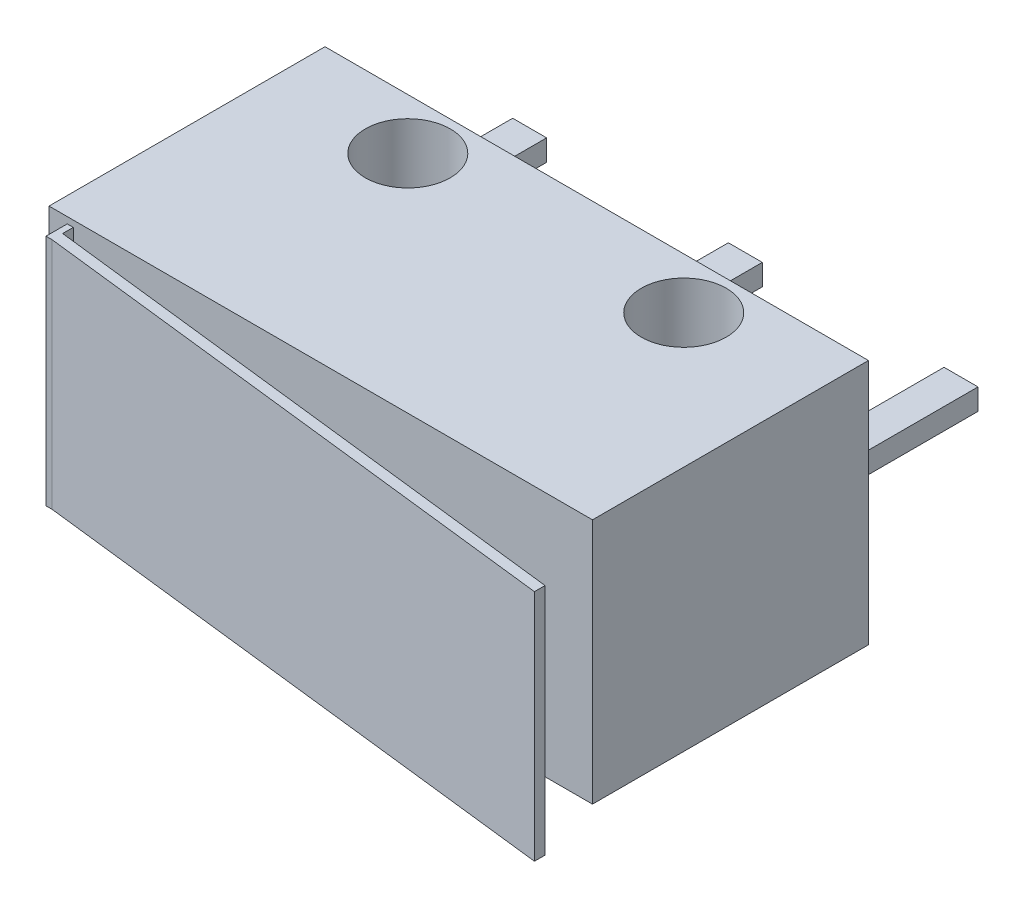
ISO-10303-21;
HEADER;
FILE_DESCRIPTION(('STEP AP214'),'2;1');
FILE_NAME('part.step','',(''),(''),'','','');
FILE_SCHEMA(('AUTOMOTIVE_DESIGN { 1 0 10303 214 1 1 1 1 }'));
ENDSEC;
DATA;
#1=APPLICATION_CONTEXT('core data for automotive mechanical design processes');
#2=APPLICATION_PROTOCOL_DEFINITION('international standard','automotive_design',2000,#1);
#3=PRODUCT_CONTEXT('',#1,'mechanical');
#4=PRODUCT('Part','Part','',(#3));
#5=PRODUCT_RELATED_PRODUCT_CATEGORY('part','',(#4));
#6=PRODUCT_DEFINITION_FORMATION('','',#4);
#7=PRODUCT_DEFINITION_CONTEXT('part definition',#1,'design');
#8=PRODUCT_DEFINITION('design','',#6,#7);
#9=PRODUCT_DEFINITION_SHAPE('','',#8);
#10=(LENGTH_UNIT() NAMED_UNIT(*) SI_UNIT(.MILLI.,.METRE.));
#11=(NAMED_UNIT(*) PLANE_ANGLE_UNIT() SI_UNIT($,.RADIAN.));
#12=(NAMED_UNIT(*) SI_UNIT($,.STERADIAN.) SOLID_ANGLE_UNIT());
#13=UNCERTAINTY_MEASURE_WITH_UNIT(LENGTH_MEASURE(1.E-05),#10,'distance_accuracy_value','');
#14=(GEOMETRIC_REPRESENTATION_CONTEXT(3) GLOBAL_UNCERTAINTY_ASSIGNED_CONTEXT((#13)) GLOBAL_UNIT_ASSIGNED_CONTEXT((#10,
#11,#12)) REPRESENTATION_CONTEXT('',''));
#15=CARTESIAN_POINT('',(0.,0.,0.));
#16=DIRECTION('',(0.,0.,1.));
#17=DIRECTION('',(1.,0.,0.));
#18=AXIS2_PLACEMENT_3D('',#15,#16,#17);
#19=CARTESIAN_POINT('',(-6.4,5.8,3.25));
#20=DIRECTION('',(0.,0.,-1.));
#21=DIRECTION('',(-1.,0.,0.));
#22=AXIS2_PLACEMENT_3D('',#19,#20,#21);
#23=PLANE('',#22);
#24=DIRECTION('',(1.,0.,0.));
#25=VECTOR('',#24,1.);
#26=CARTESIAN_POINT('',(-6.4,0.,3.25));
#27=LINE('',#26,#25);
#28=CARTESIAN_POINT('',(-6.4,0.,3.25));
#29=VERTEX_POINT('',#28);
#30=CARTESIAN_POINT('',(6.4,0.,3.25));
#31=VERTEX_POINT('',#30);
#32=EDGE_CURVE('E390',#29,#31,#27,.T.);
#33=ORIENTED_EDGE('',*,*,#32,.T.);
#34=DIRECTION('',(0.,-1.,0.));
#35=VECTOR('',#34,1.);
#36=CARTESIAN_POINT('',(6.4,5.8,3.25));
#37=LINE('',#36,#35);
#38=CARTESIAN_POINT('',(6.4,5.8,3.25));
#39=VERTEX_POINT('',#38);
#40=EDGE_CURVE('E399',#39,#31,#37,.T.);
#41=ORIENTED_EDGE('',*,*,#40,.F.);
#42=DIRECTION('',(1.,0.,0.));
#43=VECTOR('',#42,1.);
#44=CARTESIAN_POINT('',(-6.4,5.8,3.25));
#45=LINE('',#44,#43);
#46=CARTESIAN_POINT('',(-6.4,5.8,3.25));
#47=VERTEX_POINT('',#46);
#48=EDGE_CURVE('E396',#47,#39,#45,.T.);
#49=ORIENTED_EDGE('',*,*,#48,.F.);
#50=DIRECTION('',(0.,-1.,0.));
#51=VECTOR('',#50,1.);
#52=CARTESIAN_POINT('',(-6.4,5.8,3.25));
#53=LINE('',#52,#51);
#54=EDGE_CURVE('E414',#47,#29,#53,.T.);
#55=ORIENTED_EDGE('',*,*,#54,.T.);
#56=EDGE_LOOP('',(#33,#41,#49,#55));
#57=FACE_BOUND('',#56,.T.);
#58=DIRECTION('',(0.,1.,0.));
#59=VECTOR('',#58,1.);
#60=CARTESIAN_POINT('',(-5.82899401413521,0.150000000000002,3.25));
#61=LINE('',#60,#59);
#62=CARTESIAN_POINT('',(-5.82899401413521,0.150000000000002,3.25));
#63=VERTEX_POINT('',#62);
#64=CARTESIAN_POINT('',(-5.82899401413521,5.65,3.25));
#65=VERTEX_POINT('',#64);
#66=EDGE_CURVE('E223',#63,#65,#61,.T.);
#67=ORIENTED_EDGE('',*,*,#66,.F.);
#68=DIRECTION('',(1.,0.,0.));
#69=VECTOR('',#68,1.);
#70=CARTESIAN_POINT('',(-5.97100598586479,0.150000000000002,3.25));
#71=LINE('',#70,#69);
#72=CARTESIAN_POINT('',(-5.97100598586479,0.150000000000002,3.25));
#73=VERTEX_POINT('',#72);
#74=EDGE_CURVE('E713',#73,#63,#71,.T.);
#75=ORIENTED_EDGE('',*,*,#74,.F.);
#76=DIRECTION('',(0.,-1.,0.));
#77=VECTOR('',#76,1.);
#78=CARTESIAN_POINT('',(-5.97100598586479,0.150000000000002,3.25));
#79=LINE('',#78,#77);
#80=CARTESIAN_POINT('',(-5.97100598586479,5.65,3.25));
#81=VERTEX_POINT('',#80);
#82=EDGE_CURVE('E68',#81,#73,#79,.T.);
#83=ORIENTED_EDGE('',*,*,#82,.F.);
#84=DIRECTION('',(-1.,0.,0.));
#85=VECTOR('',#84,1.);
#86=CARTESIAN_POINT('',(-5.97100598586479,5.65,3.25));
#87=LINE('',#86,#85);
#88=EDGE_CURVE('E726',#65,#81,#87,.T.);
#89=ORIENTED_EDGE('',*,*,#88,.F.);
#90=EDGE_LOOP('',(#67,#75,#83,#89));
#91=FACE_BOUND('',#90,.T.);
#92=ADVANCED_FACE('F45',(#57,#91),#23,.F.);
#93=CARTESIAN_POINT('',(-6.4,5.8,-3.25));
#94=DIRECTION('',(0.,0.,1.));
#95=DIRECTION('',(1.,0.,0.));
#96=AXIS2_PLACEMENT_3D('',#93,#94,#95);
#97=PLANE('',#96);
#98=DIRECTION('',(1.,0.,0.));
#99=VECTOR('',#98,1.);
#100=CARTESIAN_POINT('',(0.4,3.05127711530208,-3.25));
#101=LINE('',#100,#99);
#102=CARTESIAN_POINT('',(-0.4,3.05127711530208,-3.25));
#103=VERTEX_POINT('',#102);
#104=CARTESIAN_POINT('',(0.4,3.05127711530208,-3.25));
#105=VERTEX_POINT('',#104);
#106=EDGE_CURVE('E258',#103,#105,#101,.T.);
#107=ORIENTED_EDGE('',*,*,#106,.F.);
#108=DIRECTION('',(0.,1.,0.));
#109=VECTOR('',#108,1.);
#110=CARTESIAN_POINT('',(-0.4,2.55127711530208,-3.25));
#111=LINE('',#110,#109);
#112=CARTESIAN_POINT('',(-0.4,2.55127711530208,-3.25));
#113=VERTEX_POINT('',#112);
#114=EDGE_CURVE('E303',#113,#103,#111,.T.);
#115=ORIENTED_EDGE('',*,*,#114,.F.);
#116=DIRECTION('',(-1.,0.,0.));
#117=VECTOR('',#116,1.);
#118=CARTESIAN_POINT('',(0.4,2.55127711530208,-3.25));
#119=LINE('',#118,#117);
#120=CARTESIAN_POINT('',(0.4,2.55127711530208,-3.25));
#121=VERTEX_POINT('',#120);
#122=EDGE_CURVE('E307',#121,#113,#119,.T.);
#123=ORIENTED_EDGE('',*,*,#122,.F.);
#124=DIRECTION('',(0.,-1.,0.));
#125=VECTOR('',#124,1.);
#126=CARTESIAN_POINT('',(0.4,2.55127711530208,-3.25));
#127=LINE('',#126,#125);
#128=EDGE_CURVE('E312',#105,#121,#127,.T.);
#129=ORIENTED_EDGE('',*,*,#128,.F.);
#130=EDGE_LOOP('',(#107,#115,#123,#129));
#131=FACE_BOUND('',#130,.T.);
#132=DIRECTION('',(-1.,0.,0.));
#133=VECTOR('',#132,1.);
#134=CARTESIAN_POINT('',(-6.4,0.,-3.25));
#135=LINE('',#134,#133);
#136=CARTESIAN_POINT('',(6.4,0.,-3.25));
#137=VERTEX_POINT('',#136);
#138=CARTESIAN_POINT('',(-6.4,0.,-3.25));
#139=VERTEX_POINT('',#138);
#140=EDGE_CURVE('E403',#137,#139,#135,.T.);
#141=ORIENTED_EDGE('',*,*,#140,.T.);
#142=DIRECTION('',(0.,-1.,0.));
#143=VECTOR('',#142,1.);
#144=CARTESIAN_POINT('',(-6.4,5.8,-3.25));
#145=LINE('',#144,#143);
#146=CARTESIAN_POINT('',(-6.4,5.8,-3.25));
#147=VERTEX_POINT('',#146);
#148=EDGE_CURVE('E54',#147,#139,#145,.T.);
#149=ORIENTED_EDGE('',*,*,#148,.F.);
#150=DIRECTION('',(-1.,0.,0.));
#151=VECTOR('',#150,1.);
#152=CARTESIAN_POINT('',(-6.4,5.8,-3.25));
#153=LINE('',#152,#151);
#154=CARTESIAN_POINT('',(6.4,5.8,-3.25));
#155=VERTEX_POINT('',#154);
#156=EDGE_CURVE('E389',#155,#147,#153,.T.);
#157=ORIENTED_EDGE('',*,*,#156,.F.);
#158=DIRECTION('',(0.,-1.,0.));
#159=VECTOR('',#158,1.);
#160=CARTESIAN_POINT('',(6.4,5.8,-3.25));
#161=LINE('',#160,#159);
#162=EDGE_CURVE('E11',#155,#137,#161,.T.);
#163=ORIENTED_EDGE('',*,*,#162,.T.);
#164=EDGE_LOOP('',(#141,#149,#157,#163));
#165=FACE_BOUND('',#164,.T.);
#166=DIRECTION('',(1.,0.,0.));
#167=VECTOR('',#166,1.);
#168=CARTESIAN_POINT('',(5.48,3.05127711530201,-3.25));
#169=LINE('',#168,#167);
#170=CARTESIAN_POINT('',(4.68,3.05127711530201,-3.25));
#171=VERTEX_POINT('',#170);
#172=CARTESIAN_POINT('',(5.48,3.05127711530201,-3.25));
#173=VERTEX_POINT('',#172);
#174=EDGE_CURVE('E290',#171,#173,#169,.T.);
#175=ORIENTED_EDGE('',*,*,#174,.F.);
#176=DIRECTION('',(0.,1.,0.));
#177=VECTOR('',#176,1.);
#178=CARTESIAN_POINT('',(4.68,2.55127711530201,-3.25));
#179=LINE('',#178,#177);
#180=CARTESIAN_POINT('',(4.68,2.55127711530201,-3.25));
#181=VERTEX_POINT('',#180);
#182=EDGE_CURVE('E342',#181,#171,#179,.T.);
#183=ORIENTED_EDGE('',*,*,#182,.F.);
#184=DIRECTION('',(-1.,0.,0.));
#185=VECTOR('',#184,1.);
#186=CARTESIAN_POINT('',(5.48,2.55127711530201,-3.25));
#187=LINE('',#186,#185);
#188=CARTESIAN_POINT('',(5.48,2.55127711530201,-3.25));
#189=VERTEX_POINT('',#188);
#190=EDGE_CURVE('E346',#189,#181,#187,.T.);
#191=ORIENTED_EDGE('',*,*,#190,.F.);
#192=DIRECTION('',(0.,-1.,0.));
#193=VECTOR('',#192,1.);
#194=CARTESIAN_POINT('',(5.48,2.55127711530201,-3.25));
#195=LINE('',#194,#193);
#196=EDGE_CURVE('E351',#173,#189,#195,.T.);
#197=ORIENTED_EDGE('',*,*,#196,.F.);
#198=EDGE_LOOP('',(#175,#183,#191,#197));
#199=FACE_BOUND('',#198,.T.);
#200=DIRECTION('',(0.,1.,0.));
#201=VECTOR('',#200,1.);
#202=CARTESIAN_POINT('',(-5.48,2.55127711530215,-3.25));
#203=LINE('',#202,#201);
#204=CARTESIAN_POINT('',(-5.48,2.55127711530215,-3.25));
#205=VERTEX_POINT('',#204);
#206=CARTESIAN_POINT('',(-5.48,3.05127711530215,-3.25));
#207=VERTEX_POINT('',#206);
#208=EDGE_CURVE('E253',#205,#207,#203,.T.);
#209=ORIENTED_EDGE('',*,*,#208,.F.);
#210=DIRECTION('',(-1.,0.,0.));
#211=VECTOR('',#210,1.);
#212=CARTESIAN_POINT('',(-4.68,2.55127711530215,-3.25));
#213=LINE('',#212,#211);
#214=CARTESIAN_POINT('',(-4.68,2.55127711530215,-3.25));
#215=VERTEX_POINT('',#214);
#216=EDGE_CURVE('E243',#215,#205,#213,.T.);
#217=ORIENTED_EDGE('',*,*,#216,.F.);
#218=DIRECTION('',(0.,-1.,0.));
#219=VECTOR('',#218,1.);
#220=CARTESIAN_POINT('',(-4.68,2.55127711530215,-3.25));
#221=LINE('',#220,#219);
#222=CARTESIAN_POINT('',(-4.68,3.05127711530215,-3.25));
#223=VERTEX_POINT('',#222);
#224=EDGE_CURVE('E262',#223,#215,#221,.T.);
#225=ORIENTED_EDGE('',*,*,#224,.F.);
#226=DIRECTION('',(1.,0.,0.));
#227=VECTOR('',#226,1.);
#228=CARTESIAN_POINT('',(-4.68,3.05127711530215,-3.25));
#229=LINE('',#228,#227);
#230=EDGE_CURVE('E257',#207,#223,#229,.T.);
#231=ORIENTED_EDGE('',*,*,#230,.F.);
#232=EDGE_LOOP('',(#209,#217,#225,#231));
#233=FACE_BOUND('',#232,.T.);
#234=ADVANCED_FACE('F440',(#131,#165,#199,#233),#97,.F.);
#235=CARTESIAN_POINT('',(0.,5.8,0.));
#236=DIRECTION('',(0.,-1.,0.));
#237=DIRECTION('',(0.,0.,-1.));
#238=AXIS2_PLACEMENT_3D('',#235,#236,#237);
#239=PLANE('',#238);
#240=DIRECTION('',(0.,0.,-1.));
#241=VECTOR('',#240,1.);
#242=CARTESIAN_POINT('',(6.4,5.8,3.25));
#243=LINE('',#242,#241);
#244=EDGE_CURVE('E385',#39,#155,#243,.T.);
#245=ORIENTED_EDGE('',*,*,#244,.T.);
#246=ORIENTED_EDGE('',*,*,#156,.T.);
#247=DIRECTION('',(0.,0.,1.));
#248=VECTOR('',#247,1.);
#249=CARTESIAN_POINT('',(-6.4,5.8,3.25));
#250=LINE('',#249,#248);
#251=EDGE_CURVE('E393',#147,#47,#250,.T.);
#252=ORIENTED_EDGE('',*,*,#251,.T.);
#253=ORIENTED_EDGE('',*,*,#48,.T.);
#254=EDGE_LOOP('',(#245,#246,#252,#253));
#255=FACE_BOUND('',#254,.T.);
#256=CARTESIAN_POINT('',(-3.25,5.8,-2.05));
#257=DIRECTION('',(0.,1.,0.));
#258=DIRECTION('',(0.,0.,1.));
#259=AXIS2_PLACEMENT_3D('',#256,#257,#258);
#260=CIRCLE('',#259,1.);
#261=CARTESIAN_POINT('',(-3.25,5.8,-1.05));
#262=VERTEX_POINT('',#261);
#263=EDGE_CURVE('E377',#262,#262,#260,.T.);
#264=ORIENTED_EDGE('',*,*,#263,.F.);
#265=EDGE_LOOP('',(#264));
#266=FACE_BOUND('',#265,.T.);
#267=CARTESIAN_POINT('',(3.25,5.8,-2.05));
#268=DIRECTION('',(0.,1.,0.));
#269=DIRECTION('',(0.,0.,-1.));
#270=AXIS2_PLACEMENT_3D('',#267,#268,#269);
#271=CIRCLE('',#270,1.);
#272=CARTESIAN_POINT('',(3.25,5.8,-3.05));
#273=VERTEX_POINT('',#272);
#274=EDGE_CURVE('E369',#273,#273,#271,.T.);
#275=ORIENTED_EDGE('',*,*,#274,.F.);
#276=EDGE_LOOP('',(#275));
#277=FACE_BOUND('',#276,.T.);
#278=ADVANCED_FACE('F438',(#255,#266,#277),#239,.F.);
#279=CARTESIAN_POINT('',(0.,0.,0.));
#280=DIRECTION('',(0.,-1.,0.));
#281=DIRECTION('',(0.,0.,-1.));
#282=AXIS2_PLACEMENT_3D('',#279,#280,#281);
#283=PLANE('',#282);
#284=CARTESIAN_POINT('',(-3.25,0.,-2.05));
#285=DIRECTION('',(0.,1.,0.));
#286=DIRECTION('',(0.,0.,1.));
#287=AXIS2_PLACEMENT_3D('',#284,#285,#286);
#288=CIRCLE('',#287,1.);
#289=CARTESIAN_POINT('',(-3.25,0.,-1.05));
#290=VERTEX_POINT('',#289);
#291=EDGE_CURVE('E373',#290,#290,#288,.T.);
#292=ORIENTED_EDGE('',*,*,#291,.T.);
#293=EDGE_LOOP('',(#292));
#294=FACE_BOUND('',#293,.T.);
#295=DIRECTION('',(0.,0.,-1.));
#296=VECTOR('',#295,1.);
#297=CARTESIAN_POINT('',(6.4,0.,3.25));
#298=LINE('',#297,#296);
#299=EDGE_CURVE('E381',#31,#137,#298,.T.);
#300=ORIENTED_EDGE('',*,*,#299,.F.);
#301=ORIENTED_EDGE('',*,*,#32,.F.);
#302=DIRECTION('',(0.,0.,1.));
#303=VECTOR('',#302,1.);
#304=CARTESIAN_POINT('',(-6.4,0.,3.25));
#305=LINE('',#304,#303);
#306=EDGE_CURVE('E406',#139,#29,#305,.T.);
#307=ORIENTED_EDGE('',*,*,#306,.F.);
#308=ORIENTED_EDGE('',*,*,#140,.F.);
#309=EDGE_LOOP('',(#300,#301,#307,#308));
#310=FACE_BOUND('',#309,.T.);
#311=CARTESIAN_POINT('',(3.25,0.,-2.05));
#312=DIRECTION('',(0.,1.,0.));
#313=DIRECTION('',(0.,0.,-1.));
#314=AXIS2_PLACEMENT_3D('',#311,#312,#313);
#315=CIRCLE('',#314,1.);
#316=CARTESIAN_POINT('',(3.25,0.,-3.05));
#317=VERTEX_POINT('',#316);
#318=EDGE_CURVE('E284',#317,#317,#315,.T.);
#319=ORIENTED_EDGE('',*,*,#318,.T.);
#320=EDGE_LOOP('',(#319));
#321=FACE_BOUND('',#320,.T.);
#322=ADVANCED_FACE('F429',(#294,#310,#321),#283,.T.);
#323=CARTESIAN_POINT('',(6.4,5.8,3.25));
#324=DIRECTION('',(-1.,0.,0.));
#325=DIRECTION('',(0.,0.,1.));
#326=AXIS2_PLACEMENT_3D('',#323,#324,#325);
#327=PLANE('',#326);
#328=ORIENTED_EDGE('',*,*,#299,.T.);
#329=ORIENTED_EDGE('',*,*,#162,.F.);
#330=ORIENTED_EDGE('',*,*,#244,.F.);
#331=ORIENTED_EDGE('',*,*,#40,.T.);
#332=EDGE_LOOP('',(#328,#329,#330,#331));
#333=FACE_BOUND('',#332,.T.);
#334=ADVANCED_FACE('F47',(#333),#327,.F.);
#335=CARTESIAN_POINT('',(-6.4,5.8,3.25));
#336=DIRECTION('',(1.,0.,0.));
#337=DIRECTION('',(0.,0.,-1.));
#338=AXIS2_PLACEMENT_3D('',#335,#336,#337);
#339=PLANE('',#338);
#340=ORIENTED_EDGE('',*,*,#306,.T.);
#341=ORIENTED_EDGE('',*,*,#54,.F.);
#342=ORIENTED_EDGE('',*,*,#251,.F.);
#343=ORIENTED_EDGE('',*,*,#148,.T.);
#344=EDGE_LOOP('',(#340,#341,#342,#343));
#345=FACE_BOUND('',#344,.T.);
#346=ADVANCED_FACE('F423',(#345),#339,.F.);
#347=CARTESIAN_POINT('',(-3.25,5.8,-2.05));
#348=DIRECTION('',(0.,-1.,0.));
#349=DIRECTION('',(0.,0.,-1.));
#350=AXIS2_PLACEMENT_3D('',#347,#348,#349);
#351=CYLINDRICAL_SURFACE('',#350,1.);
#352=ORIENTED_EDGE('',*,*,#263,.T.);
#353=EDGE_LOOP('',(#352));
#354=FACE_BOUND('',#353,.T.);
#355=ORIENTED_EDGE('',*,*,#291,.F.);
#356=EDGE_LOOP('',(#355));
#357=FACE_BOUND('',#356,.T.);
#358=ADVANCED_FACE('F481',(#354,#357),#351,.F.);
#359=CARTESIAN_POINT('',(3.25,5.8,-2.05));
#360=DIRECTION('',(0.,-1.,0.));
#361=DIRECTION('',(0.,0.,-1.));
#362=AXIS2_PLACEMENT_3D('',#359,#360,#361);
#363=CYLINDRICAL_SURFACE('',#362,1.);
#364=ORIENTED_EDGE('',*,*,#274,.T.);
#365=EDGE_LOOP('',(#364));
#366=FACE_BOUND('',#365,.T.);
#367=ORIENTED_EDGE('',*,*,#318,.F.);
#368=EDGE_LOOP('',(#367));
#369=FACE_BOUND('',#368,.T.);
#370=ADVANCED_FACE('F486',(#366,#369),#363,.F.);
#371=CARTESIAN_POINT('',(5.48,3.05127711530201,-6.75));
#372=DIRECTION('',(0.,-1.,0.));
#373=DIRECTION('',(0.,0.,-1.));
#374=AXIS2_PLACEMENT_3D('',#371,#372,#373);
#375=PLANE('',#374);
#376=ORIENTED_EDGE('',*,*,#174,.T.);
#377=DIRECTION('',(0.,0.,1.));
#378=VECTOR('',#377,1.);
#379=CARTESIAN_POINT('',(5.48,3.05127711530201,-6.75));
#380=LINE('',#379,#378);
#381=CARTESIAN_POINT('',(5.48,3.05127711530201,-6.75));
#382=VERTEX_POINT('',#381);
#383=EDGE_CURVE('E225',#382,#173,#380,.T.);
#384=ORIENTED_EDGE('',*,*,#383,.F.);
#385=DIRECTION('',(1.,0.,0.));
#386=VECTOR('',#385,1.);
#387=CARTESIAN_POINT('',(5.48,3.05127711530201,-6.75));
#388=LINE('',#387,#386);
#389=CARTESIAN_POINT('',(4.68,3.05127711530201,-6.75));
#390=VERTEX_POINT('',#389);
#391=EDGE_CURVE('E347',#390,#382,#388,.T.);
#392=ORIENTED_EDGE('',*,*,#391,.F.);
#393=DIRECTION('',(0.,0.,1.));
#394=VECTOR('',#393,1.);
#395=CARTESIAN_POINT('',(4.68,3.05127711530201,-6.75));
#396=LINE('',#395,#394);
#397=EDGE_CURVE('E337',#390,#171,#396,.T.);
#398=ORIENTED_EDGE('',*,*,#397,.T.);
#399=EDGE_LOOP('',(#376,#384,#392,#398));
#400=FACE_BOUND('',#399,.T.);
#401=ADVANCED_FACE('F503',(#400),#375,.F.);
#402=CARTESIAN_POINT('',(5.48,2.55127711530201,-6.75));
#403=DIRECTION('',(-1.,0.,0.));
#404=DIRECTION('',(0.,0.,1.));
#405=AXIS2_PLACEMENT_3D('',#402,#403,#404);
#406=PLANE('',#405);
#407=ORIENTED_EDGE('',*,*,#196,.T.);
#408=DIRECTION('',(0.,0.,1.));
#409=VECTOR('',#408,1.);
#410=CARTESIAN_POINT('',(5.48,2.55127711530201,-6.75));
#411=LINE('',#410,#409);
#412=CARTESIAN_POINT('',(5.48,2.55127711530201,-6.75));
#413=VERTEX_POINT('',#412);
#414=EDGE_CURVE('E231',#413,#189,#411,.T.);
#415=ORIENTED_EDGE('',*,*,#414,.F.);
#416=DIRECTION('',(0.,-1.,0.));
#417=VECTOR('',#416,1.);
#418=CARTESIAN_POINT('',(5.48,2.55127711530201,-6.75));
#419=LINE('',#418,#417);
#420=EDGE_CURVE('E363',#382,#413,#419,.T.);
#421=ORIENTED_EDGE('',*,*,#420,.F.);
#422=ORIENTED_EDGE('',*,*,#383,.T.);
#423=EDGE_LOOP('',(#407,#415,#421,#422));
#424=FACE_BOUND('',#423,.T.);
#425=ADVANCED_FACE('F517',(#424),#406,.F.);
#426=CARTESIAN_POINT('',(5.48,2.55127711530201,-6.75));
#427=DIRECTION('',(0.,1.,0.));
#428=DIRECTION('',(0.,0.,1.));
#429=AXIS2_PLACEMENT_3D('',#426,#427,#428);
#430=PLANE('',#429);
#431=ORIENTED_EDGE('',*,*,#190,.T.);
#432=DIRECTION('',(0.,0.,1.));
#433=VECTOR('',#432,1.);
#434=CARTESIAN_POINT('',(4.68,2.55127711530201,-6.75));
#435=LINE('',#434,#433);
#436=CARTESIAN_POINT('',(4.68,2.55127711530201,-6.75));
#437=VERTEX_POINT('',#436);
#438=EDGE_CURVE('E333',#437,#181,#435,.T.);
#439=ORIENTED_EDGE('',*,*,#438,.F.);
#440=DIRECTION('',(-1.,0.,0.));
#441=VECTOR('',#440,1.);
#442=CARTESIAN_POINT('',(5.48,2.55127711530201,-6.75));
#443=LINE('',#442,#441);
#444=EDGE_CURVE('E360',#413,#437,#443,.T.);
#445=ORIENTED_EDGE('',*,*,#444,.F.);
#446=ORIENTED_EDGE('',*,*,#414,.T.);
#447=EDGE_LOOP('',(#431,#439,#445,#446));
#448=FACE_BOUND('',#447,.T.);
#449=ADVANCED_FACE('F513',(#448),#430,.F.);
#450=CARTESIAN_POINT('',(4.68,2.55127711530201,-6.75));
#451=DIRECTION('',(1.,0.,0.));
#452=DIRECTION('',(0.,0.,-1.));
#453=AXIS2_PLACEMENT_3D('',#450,#451,#452);
#454=PLANE('',#453);
#455=ORIENTED_EDGE('',*,*,#182,.T.);
#456=ORIENTED_EDGE('',*,*,#397,.F.);
#457=DIRECTION('',(0.,1.,0.));
#458=VECTOR('',#457,1.);
#459=CARTESIAN_POINT('',(4.68,2.55127711530201,-6.75));
#460=LINE('',#459,#458);
#461=EDGE_CURVE('E341',#437,#390,#460,.T.);
#462=ORIENTED_EDGE('',*,*,#461,.F.);
#463=ORIENTED_EDGE('',*,*,#438,.T.);
#464=EDGE_LOOP('',(#455,#456,#462,#463));
#465=FACE_BOUND('',#464,.T.);
#466=ADVANCED_FACE('F509',(#465),#454,.F.);
#467=CARTESIAN_POINT('',(0.,0.,-6.75));
#468=DIRECTION('',(0.,0.,-1.));
#469=DIRECTION('',(-1.,0.,0.));
#470=AXIS2_PLACEMENT_3D('',#467,#468,#469);
#471=PLANE('',#470);
#472=ORIENTED_EDGE('',*,*,#391,.T.);
#473=ORIENTED_EDGE('',*,*,#420,.T.);
#474=ORIENTED_EDGE('',*,*,#444,.T.);
#475=ORIENTED_EDGE('',*,*,#461,.T.);
#476=EDGE_LOOP('',(#472,#473,#474,#475));
#477=FACE_BOUND('',#476,.T.);
#478=ADVANCED_FACE('F505',(#477),#471,.T.);
#479=CARTESIAN_POINT('',(0.4,3.05127711530208,-6.75));
#480=DIRECTION('',(0.,-1.,0.));
#481=DIRECTION('',(0.,0.,-1.));
#482=AXIS2_PLACEMENT_3D('',#479,#480,#481);
#483=PLANE('',#482);
#484=ORIENTED_EDGE('',*,*,#106,.T.);
#485=DIRECTION('',(0.,0.,1.));
#486=VECTOR('',#485,1.);
#487=CARTESIAN_POINT('',(0.4,3.05127711530208,-6.75));
#488=LINE('',#487,#486);
#489=CARTESIAN_POINT('',(0.4,3.05127711530208,-6.75));
#490=VERTEX_POINT('',#489);
#491=EDGE_CURVE('E285',#490,#105,#488,.T.);
#492=ORIENTED_EDGE('',*,*,#491,.F.);
#493=DIRECTION('',(1.,0.,0.));
#494=VECTOR('',#493,1.);
#495=CARTESIAN_POINT('',(0.4,3.05127711530208,-6.75));
#496=LINE('',#495,#494);
#497=CARTESIAN_POINT('',(-0.4,3.05127711530208,-6.75));
#498=VERTEX_POINT('',#497);
#499=EDGE_CURVE('E308',#498,#490,#496,.T.);
#500=ORIENTED_EDGE('',*,*,#499,.F.);
#501=DIRECTION('',(0.,0.,1.));
#502=VECTOR('',#501,1.);
#503=CARTESIAN_POINT('',(-0.4,3.05127711530208,-6.75));
#504=LINE('',#503,#502);
#505=EDGE_CURVE('E298',#498,#103,#504,.T.);
#506=ORIENTED_EDGE('',*,*,#505,.T.);
#507=EDGE_LOOP('',(#484,#492,#500,#506));
#508=FACE_BOUND('',#507,.T.);
#509=ADVANCED_FACE('F508',(#508),#483,.F.);
#510=CARTESIAN_POINT('',(0.4,2.55127711530208,-6.75));
#511=DIRECTION('',(-1.,0.,0.));
#512=DIRECTION('',(0.,0.,1.));
#513=AXIS2_PLACEMENT_3D('',#510,#511,#512);
#514=PLANE('',#513);
#515=ORIENTED_EDGE('',*,*,#128,.T.);
#516=DIRECTION('',(0.,0.,1.));
#517=VECTOR('',#516,1.);
#518=CARTESIAN_POINT('',(0.4,2.55127711530208,-6.75));
#519=LINE('',#518,#517);
#520=CARTESIAN_POINT('',(0.4,2.55127711530208,-6.75));
#521=VERTEX_POINT('',#520);
#522=EDGE_CURVE('E289',#521,#121,#519,.T.);
#523=ORIENTED_EDGE('',*,*,#522,.F.);
#524=DIRECTION('',(0.,-1.,0.));
#525=VECTOR('',#524,1.);
#526=CARTESIAN_POINT('',(0.4,2.55127711530208,-6.75));
#527=LINE('',#526,#525);
#528=EDGE_CURVE('E324',#490,#521,#527,.T.);
#529=ORIENTED_EDGE('',*,*,#528,.F.);
#530=ORIENTED_EDGE('',*,*,#491,.T.);
#531=EDGE_LOOP('',(#515,#523,#529,#530));
#532=FACE_BOUND('',#531,.T.);
#533=ADVANCED_FACE('F535',(#532),#514,.F.);
#534=CARTESIAN_POINT('',(0.4,2.55127711530208,-6.75));
#535=DIRECTION('',(0.,1.,0.));
#536=DIRECTION('',(0.,0.,1.));
#537=AXIS2_PLACEMENT_3D('',#534,#535,#536);
#538=PLANE('',#537);
#539=ORIENTED_EDGE('',*,*,#122,.T.);
#540=DIRECTION('',(0.,0.,1.));
#541=VECTOR('',#540,1.);
#542=CARTESIAN_POINT('',(-0.4,2.55127711530208,-6.75));
#543=LINE('',#542,#541);
#544=CARTESIAN_POINT('',(-0.4,2.55127711530208,-6.75));
#545=VERTEX_POINT('',#544);
#546=EDGE_CURVE('E294',#545,#113,#543,.T.);
#547=ORIENTED_EDGE('',*,*,#546,.F.);
#548=DIRECTION('',(-1.,0.,0.));
#549=VECTOR('',#548,1.);
#550=CARTESIAN_POINT('',(0.4,2.55127711530208,-6.75));
#551=LINE('',#550,#549);
#552=EDGE_CURVE('E321',#521,#545,#551,.T.);
#553=ORIENTED_EDGE('',*,*,#552,.F.);
#554=ORIENTED_EDGE('',*,*,#522,.T.);
#555=EDGE_LOOP('',(#539,#547,#553,#554));
#556=FACE_BOUND('',#555,.T.);
#557=ADVANCED_FACE('F531',(#556),#538,.F.);
#558=CARTESIAN_POINT('',(-0.4,2.55127711530208,-6.75));
#559=DIRECTION('',(1.,0.,0.));
#560=DIRECTION('',(0.,0.,-1.));
#561=AXIS2_PLACEMENT_3D('',#558,#559,#560);
#562=PLANE('',#561);
#563=ORIENTED_EDGE('',*,*,#114,.T.);
#564=ORIENTED_EDGE('',*,*,#505,.F.);
#565=DIRECTION('',(0.,1.,0.));
#566=VECTOR('',#565,1.);
#567=CARTESIAN_POINT('',(-0.4,2.55127711530208,-6.75));
#568=LINE('',#567,#566);
#569=EDGE_CURVE('E302',#545,#498,#568,.T.);
#570=ORIENTED_EDGE('',*,*,#569,.F.);
#571=ORIENTED_EDGE('',*,*,#546,.T.);
#572=EDGE_LOOP('',(#563,#564,#570,#571));
#573=FACE_BOUND('',#572,.T.);
#574=ADVANCED_FACE('F527',(#573),#562,.F.);
#575=CARTESIAN_POINT('',(0.,0.,-6.75));
#576=DIRECTION('',(0.,0.,-1.));
#577=DIRECTION('',(-1.,0.,0.));
#578=AXIS2_PLACEMENT_3D('',#575,#576,#577);
#579=PLANE('',#578);
#580=ORIENTED_EDGE('',*,*,#499,.T.);
#581=ORIENTED_EDGE('',*,*,#528,.T.);
#582=ORIENTED_EDGE('',*,*,#552,.T.);
#583=ORIENTED_EDGE('',*,*,#569,.T.);
#584=EDGE_LOOP('',(#580,#581,#582,#583));
#585=FACE_BOUND('',#584,.T.);
#586=ADVANCED_FACE('F469',(#585),#579,.T.);
#587=CARTESIAN_POINT('',(-5.48,2.55127711530215,-6.75));
#588=DIRECTION('',(1.,0.,0.));
#589=DIRECTION('',(0.,0.,-1.));
#590=AXIS2_PLACEMENT_3D('',#587,#588,#589);
#591=PLANE('',#590);
#592=ORIENTED_EDGE('',*,*,#208,.T.);
#593=DIRECTION('',(0.,0.,1.));
#594=VECTOR('',#593,1.);
#595=CARTESIAN_POINT('',(-5.48,3.05127711530215,-6.75));
#596=LINE('',#595,#594);
#597=CARTESIAN_POINT('',(-5.48,3.05127711530215,-6.75));
#598=VERTEX_POINT('',#597);
#599=EDGE_CURVE('E280',#598,#207,#596,.T.);
#600=ORIENTED_EDGE('',*,*,#599,.F.);
#601=DIRECTION('',(0.,1.,0.));
#602=VECTOR('',#601,1.);
#603=CARTESIAN_POINT('',(-5.48,2.55127711530215,-6.75));
#604=LINE('',#603,#602);
#605=CARTESIAN_POINT('',(-5.48,2.55127711530215,-6.75));
#606=VERTEX_POINT('',#605);
#607=EDGE_CURVE('E238',#606,#598,#604,.T.);
#608=ORIENTED_EDGE('',*,*,#607,.F.);
#609=DIRECTION('',(0.,0.,1.));
#610=VECTOR('',#609,1.);
#611=CARTESIAN_POINT('',(-5.48,2.55127711530215,-6.75));
#612=LINE('',#611,#610);
#613=EDGE_CURVE('E252',#606,#205,#612,.T.);
#614=ORIENTED_EDGE('',*,*,#613,.T.);
#615=EDGE_LOOP('',(#592,#600,#608,#614));
#616=FACE_BOUND('',#615,.T.);
#617=ADVANCED_FACE('F453',(#616),#591,.F.);
#618=CARTESIAN_POINT('',(-4.68,3.05127711530215,-6.75));
#619=DIRECTION('',(0.,-1.,0.));
#620=DIRECTION('',(0.,0.,-1.));
#621=AXIS2_PLACEMENT_3D('',#618,#619,#620);
#622=PLANE('',#621);
#623=ORIENTED_EDGE('',*,*,#230,.T.);
#624=DIRECTION('',(0.,0.,1.));
#625=VECTOR('',#624,1.);
#626=CARTESIAN_POINT('',(-4.68,3.05127711530215,-6.75));
#627=LINE('',#626,#625);
#628=CARTESIAN_POINT('',(-4.68,3.05127711530215,-6.75));
#629=VERTEX_POINT('',#628);
#630=EDGE_CURVE('E276',#629,#223,#627,.T.);
#631=ORIENTED_EDGE('',*,*,#630,.F.);
#632=DIRECTION('',(1.,0.,0.));
#633=VECTOR('',#632,1.);
#634=CARTESIAN_POINT('',(-4.68,3.05127711530215,-6.75));
#635=LINE('',#634,#633);
#636=EDGE_CURVE('E242',#598,#629,#635,.T.);
#637=ORIENTED_EDGE('',*,*,#636,.F.);
#638=ORIENTED_EDGE('',*,*,#599,.T.);
#639=EDGE_LOOP('',(#623,#631,#637,#638));
#640=FACE_BOUND('',#639,.T.);
#641=ADVANCED_FACE('F461',(#640),#622,.F.);
#642=CARTESIAN_POINT('',(-4.68,2.55127711530215,-6.75));
#643=DIRECTION('',(-1.,0.,0.));
#644=DIRECTION('',(0.,0.,1.));
#645=AXIS2_PLACEMENT_3D('',#642,#643,#644);
#646=PLANE('',#645);
#647=ORIENTED_EDGE('',*,*,#224,.T.);
#648=DIRECTION('',(0.,0.,1.));
#649=VECTOR('',#648,1.);
#650=CARTESIAN_POINT('',(-4.68,2.55127711530215,-6.75));
#651=LINE('',#650,#649);
#652=CARTESIAN_POINT('',(-4.68,2.55127711530215,-6.75));
#653=VERTEX_POINT('',#652);
#654=EDGE_CURVE('E272',#653,#215,#651,.T.);
#655=ORIENTED_EDGE('',*,*,#654,.F.);
#656=DIRECTION('',(0.,-1.,0.));
#657=VECTOR('',#656,1.);
#658=CARTESIAN_POINT('',(-4.68,2.55127711530215,-6.75));
#659=LINE('',#658,#657);
#660=EDGE_CURVE('E246',#629,#653,#659,.T.);
#661=ORIENTED_EDGE('',*,*,#660,.F.);
#662=ORIENTED_EDGE('',*,*,#630,.T.);
#663=EDGE_LOOP('',(#647,#655,#661,#662));
#664=FACE_BOUND('',#663,.T.);
#665=ADVANCED_FACE('F459',(#664),#646,.F.);
#666=CARTESIAN_POINT('',(-4.68,2.55127711530215,-6.75));
#667=DIRECTION('',(0.,1.,0.));
#668=DIRECTION('',(0.,0.,1.));
#669=AXIS2_PLACEMENT_3D('',#666,#667,#668);
#670=PLANE('',#669);
#671=ORIENTED_EDGE('',*,*,#216,.T.);
#672=ORIENTED_EDGE('',*,*,#613,.F.);
#673=DIRECTION('',(-1.,0.,0.));
#674=VECTOR('',#673,1.);
#675=CARTESIAN_POINT('',(-4.68,2.55127711530215,-6.75));
#676=LINE('',#675,#674);
#677=EDGE_CURVE('E249',#653,#606,#676,.T.);
#678=ORIENTED_EDGE('',*,*,#677,.F.);
#679=ORIENTED_EDGE('',*,*,#654,.T.);
#680=EDGE_LOOP('',(#671,#672,#678,#679));
#681=FACE_BOUND('',#680,.T.);
#682=ADVANCED_FACE('F449',(#681),#670,.F.);
#683=CARTESIAN_POINT('',(0.,0.,-6.75));
#684=DIRECTION('',(0.,0.,1.));
#685=DIRECTION('',(1.,0.,0.));
#686=AXIS2_PLACEMENT_3D('',#683,#684,#685);
#687=PLANE('',#686);
#688=ORIENTED_EDGE('',*,*,#607,.T.);
#689=ORIENTED_EDGE('',*,*,#636,.T.);
#690=ORIENTED_EDGE('',*,*,#660,.T.);
#691=ORIENTED_EDGE('',*,*,#677,.T.);
#692=EDGE_LOOP('',(#688,#689,#690,#691));
#693=FACE_BOUND('',#692,.T.);
#694=ADVANCED_FACE('F455',(#693),#687,.F.);
#695=CARTESIAN_POINT('',(-5.82899401413521,0.150000000000002,3.75));
#696=DIRECTION('',(-1.,0.,0.));
#697=DIRECTION('',(0.,0.,1.));
#698=AXIS2_PLACEMENT_3D('',#695,#696,#697);
#699=PLANE('',#698);
#700=DIRECTION('',(0.,0.,-1.));
#701=VECTOR('',#700,1.);
#702=CARTESIAN_POINT('',(-5.82899401413521,5.65,3.75));
#703=LINE('',#702,#701);
#704=CARTESIAN_POINT('',(-5.82899401413521,5.65,3.5));
#705=VERTEX_POINT('',#704);
#706=EDGE_CURVE('E61',#705,#65,#703,.T.);
#707=ORIENTED_EDGE('',*,*,#706,.F.);
#708=DIRECTION('',(0.,-1.,0.));
#709=VECTOR('',#708,1.);
#710=CARTESIAN_POINT('',(-5.82899401413521,5.65,3.5));
#711=LINE('',#710,#709);
#712=CARTESIAN_POINT('',(-5.82899401413521,0.150000000000002,3.5));
#713=VERTEX_POINT('',#712);
#714=EDGE_CURVE('E202',#705,#713,#711,.T.);
#715=ORIENTED_EDGE('',*,*,#714,.T.);
#716=DIRECTION('',(0.,0.,-1.));
#717=VECTOR('',#716,1.);
#718=CARTESIAN_POINT('',(-5.82899401413521,0.150000000000002,3.75));
#719=LINE('',#718,#717);
#720=EDGE_CURVE('E723',#713,#63,#719,.T.);
#721=ORIENTED_EDGE('',*,*,#720,.T.);
#722=ORIENTED_EDGE('',*,*,#66,.T.);
#723=EDGE_LOOP('',(#707,#715,#721,#722));
#724=FACE_BOUND('',#723,.T.);
#725=ADVANCED_FACE('F221',(#724),#699,.F.);
#726=CARTESIAN_POINT('',(-5.97100598586479,5.65,3.75));
#727=DIRECTION('',(0.,-1.,0.));
#728=DIRECTION('',(0.,0.,-1.));
#729=AXIS2_PLACEMENT_3D('',#726,#727,#728);
#730=PLANE('',#729);
#731=ORIENTED_EDGE('',*,*,#88,.T.);
#732=DIRECTION('',(0.,0.,-1.));
#733=VECTOR('',#732,1.);
#734=CARTESIAN_POINT('',(-5.97100598586479,5.65,3.75));
#735=LINE('',#734,#733);
#736=CARTESIAN_POINT('',(-5.97100598586479,5.65,3.75));
#737=VERTEX_POINT('',#736);
#738=EDGE_CURVE('E226',#737,#81,#735,.T.);
#739=ORIENTED_EDGE('',*,*,#738,.F.);
#740=DIRECTION('',(-1.,0.,0.));
#741=VECTOR('',#740,1.);
#742=CARTESIAN_POINT('',(-5.97100598586479,5.65,3.75));
#743=LINE('',#742,#741);
#744=CARTESIAN_POINT('',(-5.82899401413521,5.65,3.75));
#745=VERTEX_POINT('',#744);
#746=EDGE_CURVE('E712',#745,#737,#743,.T.);
#747=ORIENTED_EDGE('',*,*,#746,.F.);
#748=DIRECTION('',(-0.993277798079755,0.,-0.11575498193094));
#749=VECTOR('',#748,1.);
#750=CARTESIAN_POINT('',(-5.82899401413521,5.65,3.75));
#751=LINE('',#750,#749);
#752=CARTESIAN_POINT('',(7.03115002007113,5.65,5.24870030638631));
#753=VERTEX_POINT('',#752);
#754=EDGE_CURVE('E218',#753,#745,#751,.T.);
#755=ORIENTED_EDGE('',*,*,#754,.F.);
#756=DIRECTION('',(0.,0.,1.));
#757=VECTOR('',#756,1.);
#758=CARTESIAN_POINT('',(7.03115002007113,5.65,5.24870030638631));
#759=LINE('',#758,#757);
#760=CARTESIAN_POINT('',(7.03115002007113,5.65,4.99870030638631));
#761=VERTEX_POINT('',#760);
#762=EDGE_CURVE('E212',#761,#753,#759,.T.);
#763=ORIENTED_EDGE('',*,*,#762,.F.);
#764=DIRECTION('',(0.993277798079755,0.,0.11575498193094));
#765=VECTOR('',#764,1.);
#766=CARTESIAN_POINT('',(-5.82899401413521,5.65,3.5));
#767=LINE('',#766,#765);
#768=EDGE_CURVE('E204',#705,#761,#767,.T.);
#769=ORIENTED_EDGE('',*,*,#768,.F.);
#770=ORIENTED_EDGE('',*,*,#706,.T.);
#771=EDGE_LOOP('',(#731,#739,#747,#755,#763,#769,#770));
#772=FACE_BOUND('',#771,.T.);
#773=ADVANCED_FACE('F214',(#772),#730,.F.);
#774=CARTESIAN_POINT('',(-5.97100598586479,0.150000000000002,3.75));
#775=DIRECTION('',(1.,0.,0.));
#776=DIRECTION('',(0.,0.,-1.));
#777=AXIS2_PLACEMENT_3D('',#774,#775,#776);
#778=PLANE('',#777);
#779=ORIENTED_EDGE('',*,*,#82,.T.);
#780=DIRECTION('',(0.,0.,-1.));
#781=VECTOR('',#780,1.);
#782=CARTESIAN_POINT('',(-5.97100598586479,0.150000000000002,3.75));
#783=LINE('',#782,#781);
#784=CARTESIAN_POINT('',(-5.97100598586479,0.150000000000002,3.75));
#785=VERTEX_POINT('',#784);
#786=EDGE_CURVE('E234',#785,#73,#783,.T.);
#787=ORIENTED_EDGE('',*,*,#786,.F.);
#788=DIRECTION('',(0.,-1.,0.));
#789=VECTOR('',#788,1.);
#790=CARTESIAN_POINT('',(-5.97100598586479,0.150000000000002,3.75));
#791=LINE('',#790,#789);
#792=EDGE_CURVE('E716',#737,#785,#791,.T.);
#793=ORIENTED_EDGE('',*,*,#792,.F.);
#794=ORIENTED_EDGE('',*,*,#738,.T.);
#795=EDGE_LOOP('',(#779,#787,#793,#794));
#796=FACE_BOUND('',#795,.T.);
#797=ADVANCED_FACE('F626',(#796),#778,.F.);
#798=CARTESIAN_POINT('',(-5.97100598586479,0.150000000000002,3.75));
#799=DIRECTION('',(0.,1.,0.));
#800=DIRECTION('',(0.,0.,1.));
#801=AXIS2_PLACEMENT_3D('',#798,#799,#800);
#802=PLANE('',#801);
#803=ORIENTED_EDGE('',*,*,#74,.T.);
#804=ORIENTED_EDGE('',*,*,#720,.F.);
#805=DIRECTION('',(0.993277798079755,0.,0.11575498193094));
#806=VECTOR('',#805,1.);
#807=CARTESIAN_POINT('',(-5.82899401413521,0.150000000000002,3.5));
#808=LINE('',#807,#806);
#809=CARTESIAN_POINT('',(7.03115002007113,0.150000000000002,4.99870030638631));
#810=VERTEX_POINT('',#809);
#811=EDGE_CURVE('E207',#713,#810,#808,.T.);
#812=ORIENTED_EDGE('',*,*,#811,.T.);
#813=DIRECTION('',(0.,0.,1.));
#814=VECTOR('',#813,1.);
#815=CARTESIAN_POINT('',(7.03115002007113,0.150000000000002,5.24870030638631));
#816=LINE('',#815,#814);
#817=CARTESIAN_POINT('',(7.03115002007113,0.150000000000002,5.24870030638631));
#818=VERTEX_POINT('',#817);
#819=EDGE_CURVE('E691',#810,#818,#816,.T.);
#820=ORIENTED_EDGE('',*,*,#819,.T.);
#821=DIRECTION('',(-0.993277798079755,0.,-0.11575498193094));
#822=VECTOR('',#821,1.);
#823=CARTESIAN_POINT('',(-5.82899401413521,0.150000000000002,3.75));
#824=LINE('',#823,#822);
#825=CARTESIAN_POINT('',(-5.82899401413521,0.150000000000002,3.75));
#826=VERTEX_POINT('',#825);
#827=EDGE_CURVE('E700',#818,#826,#824,.T.);
#828=ORIENTED_EDGE('',*,*,#827,.T.);
#829=DIRECTION('',(1.,0.,0.));
#830=VECTOR('',#829,1.);
#831=CARTESIAN_POINT('',(-5.97100598586479,0.150000000000002,3.75));
#832=LINE('',#831,#830);
#833=EDGE_CURVE('E719',#785,#826,#832,.T.);
#834=ORIENTED_EDGE('',*,*,#833,.F.);
#835=ORIENTED_EDGE('',*,*,#786,.T.);
#836=EDGE_LOOP('',(#803,#804,#812,#820,#828,#834,#835));
#837=FACE_BOUND('',#836,.T.);
#838=ADVANCED_FACE('F637',(#837),#802,.F.);
#839=CARTESIAN_POINT('',(0.,0.,3.75));
#840=DIRECTION('',(0.,0.,-1.));
#841=DIRECTION('',(-1.,0.,0.));
#842=AXIS2_PLACEMENT_3D('',#839,#840,#841);
#843=PLANE('',#842);
#844=DIRECTION('',(0.,1.,0.));
#845=VECTOR('',#844,1.);
#846=CARTESIAN_POINT('',(-5.82899401413521,0.150000000000002,3.75));
#847=LINE('',#846,#845);
#848=EDGE_CURVE('E708',#826,#745,#847,.T.);
#849=ORIENTED_EDGE('',*,*,#848,.T.);
#850=ORIENTED_EDGE('',*,*,#746,.T.);
#851=ORIENTED_EDGE('',*,*,#792,.T.);
#852=ORIENTED_EDGE('',*,*,#833,.T.);
#853=EDGE_LOOP('',(#849,#850,#851,#852));
#854=FACE_BOUND('',#853,.T.);
#855=ADVANCED_FACE('F646',(#854),#843,.F.);
#856=CARTESIAN_POINT('',(-5.82899401413521,5.65,3.75));
#857=DIRECTION('',(-0.11575498193094,0.,0.993277798079756));
#858=DIRECTION('',(0.993277798079756,0.,0.11575498193094));
#859=AXIS2_PLACEMENT_3D('',#856,#857,#858);
#860=PLANE('',#859);
#861=ORIENTED_EDGE('',*,*,#827,.F.);
#862=DIRECTION('',(0.,-1.,0.));
#863=VECTOR('',#862,1.);
#864=CARTESIAN_POINT('',(7.03115002007113,5.65,5.24870030638631));
#865=LINE('',#864,#863);
#866=EDGE_CURVE('E692',#753,#818,#865,.T.);
#867=ORIENTED_EDGE('',*,*,#866,.F.);
#868=ORIENTED_EDGE('',*,*,#754,.T.);
#869=ORIENTED_EDGE('',*,*,#848,.F.);
#870=EDGE_LOOP('',(#861,#867,#868,#869));
#871=FACE_BOUND('',#870,.T.);
#872=ADVANCED_FACE('F657',(#871),#860,.T.);
#873=CARTESIAN_POINT('',(7.03115002007113,5.65,5.24870030638631));
#874=DIRECTION('',(1.,0.,0.));
#875=DIRECTION('',(0.,0.,-1.));
#876=AXIS2_PLACEMENT_3D('',#873,#874,#875);
#877=PLANE('',#876);
#878=ORIENTED_EDGE('',*,*,#819,.F.);
#879=DIRECTION('',(0.,-1.,0.));
#880=VECTOR('',#879,1.);
#881=CARTESIAN_POINT('',(7.03115002007113,5.65,4.99870030638631));
#882=LINE('',#881,#880);
#883=EDGE_CURVE('E211',#761,#810,#882,.T.);
#884=ORIENTED_EDGE('',*,*,#883,.F.);
#885=ORIENTED_EDGE('',*,*,#762,.T.);
#886=ORIENTED_EDGE('',*,*,#866,.T.);
#887=EDGE_LOOP('',(#878,#884,#885,#886));
#888=FACE_BOUND('',#887,.T.);
#889=ADVANCED_FACE('F667',(#888),#877,.T.);
#890=CARTESIAN_POINT('',(-5.82899401413521,5.65,3.5));
#891=DIRECTION('',(0.11575498193094,0.,-0.993277798079756));
#892=DIRECTION('',(-0.993277798079756,0.,-0.11575498193094));
#893=AXIS2_PLACEMENT_3D('',#890,#891,#892);
#894=PLANE('',#893);
#895=ORIENTED_EDGE('',*,*,#811,.F.);
#896=ORIENTED_EDGE('',*,*,#714,.F.);
#897=ORIENTED_EDGE('',*,*,#768,.T.);
#898=ORIENTED_EDGE('',*,*,#883,.T.);
#899=EDGE_LOOP('',(#895,#896,#897,#898));
#900=FACE_BOUND('',#899,.T.);
#901=ADVANCED_FACE('F203',(#900),#894,.T.);
#902=CLOSED_SHELL('',(#92,#234,#278,#322,#334,#346,#358,#370,#401,#425,#449,#466,#478,#509,#533,
#557,#574,#586,#617,#641,#665,#682,#694,#725,#773,#797,#838,#855,#872,#889,#901));
#903=MANIFOLD_SOLID_BREP('B2',#902);
#904=ADVANCED_BREP_SHAPE_REPRESENTATION('',(#18,#903),#14);
#905=SHAPE_DEFINITION_REPRESENTATION(#9,#904);
ENDSEC;
END-ISO-10303-21;
